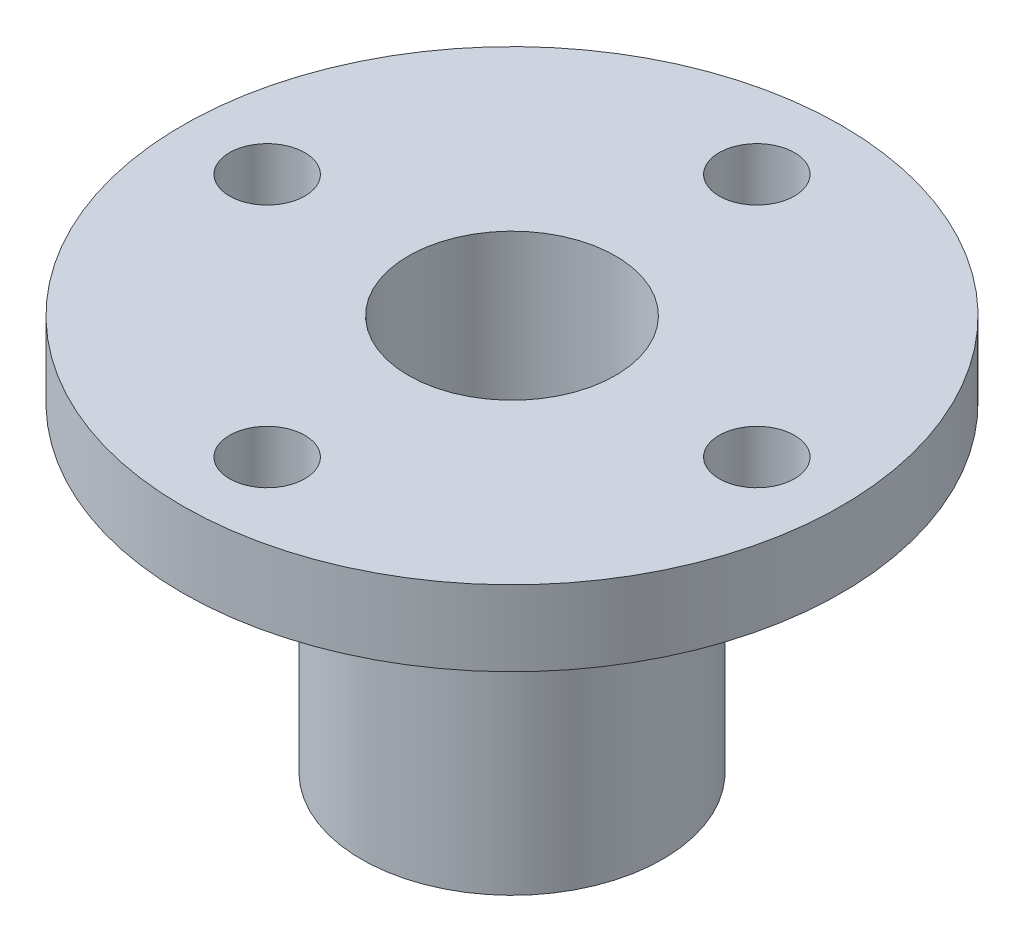
ISO-10303-21;
HEADER;
FILE_DESCRIPTION(('STEP AP214'),'2;1');
FILE_NAME('part.step','',(''),(''),'','','');
FILE_SCHEMA(('AUTOMOTIVE_DESIGN { 1 0 10303 214 1 1 1 1 }'));
ENDSEC;
DATA;
#1=APPLICATION_CONTEXT('core data for automotive mechanical design processes');
#2=APPLICATION_PROTOCOL_DEFINITION('international standard','automotive_design',2000,#1);
#3=PRODUCT_CONTEXT('',#1,'mechanical');
#4=PRODUCT('Part','Part','',(#3));
#5=PRODUCT_RELATED_PRODUCT_CATEGORY('part','',(#4));
#6=PRODUCT_DEFINITION_FORMATION('','',#4);
#7=PRODUCT_DEFINITION_CONTEXT('part definition',#1,'design');
#8=PRODUCT_DEFINITION('design','',#6,#7);
#9=PRODUCT_DEFINITION_SHAPE('','',#8);
#10=(LENGTH_UNIT() NAMED_UNIT(*) SI_UNIT(.MILLI.,.METRE.));
#11=(NAMED_UNIT(*) PLANE_ANGLE_UNIT() SI_UNIT($,.RADIAN.));
#12=(NAMED_UNIT(*) SI_UNIT($,.STERADIAN.) SOLID_ANGLE_UNIT());
#13=UNCERTAINTY_MEASURE_WITH_UNIT(LENGTH_MEASURE(1.E-05),#10,'distance_accuracy_value','');
#14=(GEOMETRIC_REPRESENTATION_CONTEXT(3) GLOBAL_UNCERTAINTY_ASSIGNED_CONTEXT((#13)) GLOBAL_UNIT_ASSIGNED_CONTEXT((#10,
#11,#12)) REPRESENTATION_CONTEXT('',''));
#15=CARTESIAN_POINT('',(0.,0.,0.));
#16=DIRECTION('',(0.,0.,1.));
#17=DIRECTION('',(1.,0.,0.));
#18=AXIS2_PLACEMENT_3D('',#15,#16,#17);
#19=CARTESIAN_POINT('',(0.,4.,0.));
#20=DIRECTION('',(0.,1.,0.));
#21=DIRECTION('',(0.,0.,1.));
#22=AXIS2_PLACEMENT_3D('',#19,#20,#21);
#23=PLANE('',#22);
#24=CARTESIAN_POINT('',(0.,4.,0.));
#25=DIRECTION('',(0.,1.,0.));
#26=DIRECTION('',(0.,0.,1.));
#27=AXIS2_PLACEMENT_3D('',#24,#25,#26);
#28=CIRCLE('',#27,5.5);
#29=CARTESIAN_POINT('',(0.,4.,5.5));
#30=VERTEX_POINT('',#29);
#31=EDGE_CURVE('E259',#30,#30,#28,.T.);
#32=ORIENTED_EDGE('',*,*,#31,.F.);
#33=EDGE_LOOP('',(#32));
#34=FACE_BOUND('',#33,.T.);
#35=CARTESIAN_POINT('',(0.,4.,13.));
#36=DIRECTION('',(0.,1.,0.));
#37=DIRECTION('',(0.,0.,1.));
#38=AXIS2_PLACEMENT_3D('',#35,#36,#37);
#39=CIRCLE('',#38,2.);
#40=CARTESIAN_POINT('',(0.,4.,15.));
#41=VERTEX_POINT('',#40);
#42=EDGE_CURVE('E57',#41,#41,#39,.T.);
#43=ORIENTED_EDGE('',*,*,#42,.F.);
#44=EDGE_LOOP('',(#43));
#45=FACE_BOUND('',#44,.T.);
#46=CARTESIAN_POINT('',(0.,4.,-13.));
#47=DIRECTION('',(0.,1.,0.));
#48=DIRECTION('',(0.,0.,1.));
#49=AXIS2_PLACEMENT_3D('',#46,#47,#48);
#50=CIRCLE('',#49,2.);
#51=CARTESIAN_POINT('',(0.,4.,-11.));
#52=VERTEX_POINT('',#51);
#53=EDGE_CURVE('E69',#52,#52,#50,.T.);
#54=ORIENTED_EDGE('',*,*,#53,.F.);
#55=EDGE_LOOP('',(#54));
#56=FACE_BOUND('',#55,.T.);
#57=CARTESIAN_POINT('',(0.,4.,0.));
#58=DIRECTION('',(0.,1.,0.));
#59=DIRECTION('',(0.,0.,1.));
#60=AXIS2_PLACEMENT_3D('',#57,#58,#59);
#61=CIRCLE('',#60,17.5);
#62=CARTESIAN_POINT('',(0.,4.,17.5));
#63=VERTEX_POINT('',#62);
#64=EDGE_CURVE('E39',#63,#63,#61,.T.);
#65=ORIENTED_EDGE('',*,*,#64,.T.);
#66=EDGE_LOOP('',(#65));
#67=FACE_BOUND('',#66,.T.);
#68=CARTESIAN_POINT('',(13.,4.,0.));
#69=DIRECTION('',(0.,1.,0.));
#70=DIRECTION('',(0.,0.,1.));
#71=AXIS2_PLACEMENT_3D('',#68,#69,#70);
#72=CIRCLE('',#71,2.);
#73=CARTESIAN_POINT('',(13.,4.,2.00000000000005));
#74=VERTEX_POINT('',#73);
#75=EDGE_CURVE('E63',#74,#74,#72,.T.);
#76=ORIENTED_EDGE('',*,*,#75,.F.);
#77=EDGE_LOOP('',(#76));
#78=FACE_BOUND('',#77,.T.);
#79=CARTESIAN_POINT('',(-13.,4.,-1.36167772214882E-13));
#80=DIRECTION('',(0.,1.,0.));
#81=DIRECTION('',(0.,0.,1.));
#82=AXIS2_PLACEMENT_3D('',#79,#80,#81);
#83=CIRCLE('',#82,2.);
#84=CARTESIAN_POINT('',(-13.,4.,1.99999999999986));
#85=VERTEX_POINT('',#84);
#86=EDGE_CURVE('E50',#85,#85,#83,.T.);
#87=ORIENTED_EDGE('',*,*,#86,.F.);
#88=EDGE_LOOP('',(#87));
#89=FACE_BOUND('',#88,.T.);
#90=ADVANCED_FACE('F31',(#34,#45,#56,#67,#78,#89),#23,.T.);
#91=CARTESIAN_POINT('',(0.,0.,0.));
#92=DIRECTION('',(0.,1.,0.));
#93=DIRECTION('',(0.,0.,1.));
#94=AXIS2_PLACEMENT_3D('',#91,#92,#93);
#95=PLANE('',#94);
#96=CARTESIAN_POINT('',(0.,0.,0.));
#97=DIRECTION('',(0.,-1.,0.));
#98=DIRECTION('',(0.,0.,-1.));
#99=AXIS2_PLACEMENT_3D('',#96,#97,#98);
#100=CIRCLE('',#99,8.);
#101=CARTESIAN_POINT('',(0.,0.,-8.));
#102=VERTEX_POINT('',#101);
#103=EDGE_CURVE('E10',#102,#102,#100,.T.);
#104=ORIENTED_EDGE('',*,*,#103,.F.);
#105=EDGE_LOOP('',(#104));
#106=FACE_BOUND('',#105,.T.);
#107=CARTESIAN_POINT('',(0.,0.,0.));
#108=DIRECTION('',(0.,1.,0.));
#109=DIRECTION('',(0.,0.,1.));
#110=AXIS2_PLACEMENT_3D('',#107,#108,#109);
#111=CIRCLE('',#110,17.5);
#112=CARTESIAN_POINT('',(0.,0.,17.5));
#113=VERTEX_POINT('',#112);
#114=EDGE_CURVE('E44',#113,#113,#111,.T.);
#115=ORIENTED_EDGE('',*,*,#114,.F.);
#116=EDGE_LOOP('',(#115));
#117=FACE_BOUND('',#116,.T.);
#118=CARTESIAN_POINT('',(0.,0.,-13.));
#119=DIRECTION('',(0.,1.,0.));
#120=DIRECTION('',(0.,0.,1.));
#121=AXIS2_PLACEMENT_3D('',#118,#119,#120);
#122=CIRCLE('',#121,2.);
#123=CARTESIAN_POINT('',(0.,0.,-11.));
#124=VERTEX_POINT('',#123);
#125=EDGE_CURVE('E66',#124,#124,#122,.T.);
#126=ORIENTED_EDGE('',*,*,#125,.T.);
#127=EDGE_LOOP('',(#126));
#128=FACE_BOUND('',#127,.T.);
#129=CARTESIAN_POINT('',(13.,0.,0.));
#130=DIRECTION('',(0.,1.,0.));
#131=DIRECTION('',(0.,0.,1.));
#132=AXIS2_PLACEMENT_3D('',#129,#130,#131);
#133=CIRCLE('',#132,2.);
#134=CARTESIAN_POINT('',(13.,0.,2.00000000000005));
#135=VERTEX_POINT('',#134);
#136=EDGE_CURVE('E60',#135,#135,#133,.T.);
#137=ORIENTED_EDGE('',*,*,#136,.T.);
#138=EDGE_LOOP('',(#137));
#139=FACE_BOUND('',#138,.T.);
#140=CARTESIAN_POINT('',(0.,0.,13.));
#141=DIRECTION('',(0.,1.,0.));
#142=DIRECTION('',(0.,0.,1.));
#143=AXIS2_PLACEMENT_3D('',#140,#141,#142);
#144=CIRCLE('',#143,2.);
#145=CARTESIAN_POINT('',(0.,0.,15.));
#146=VERTEX_POINT('',#145);
#147=EDGE_CURVE('E53',#146,#146,#144,.T.);
#148=ORIENTED_EDGE('',*,*,#147,.T.);
#149=EDGE_LOOP('',(#148));
#150=FACE_BOUND('',#149,.T.);
#151=CARTESIAN_POINT('',(-13.,0.,-1.36167772214882E-13));
#152=DIRECTION('',(0.,1.,0.));
#153=DIRECTION('',(0.,0.,1.));
#154=AXIS2_PLACEMENT_3D('',#151,#152,#153);
#155=CIRCLE('',#154,2.);
#156=CARTESIAN_POINT('',(-13.,0.,1.99999999999986));
#157=VERTEX_POINT('',#156);
#158=EDGE_CURVE('E54',#157,#157,#155,.T.);
#159=ORIENTED_EDGE('',*,*,#158,.T.);
#160=EDGE_LOOP('',(#159));
#161=FACE_BOUND('',#160,.T.);
#162=ADVANCED_FACE('F77',(#106,#117,#128,#139,#150,#161),#95,.F.);
#163=CARTESIAN_POINT('',(0.,4.,0.));
#164=DIRECTION('',(0.,-1.,0.));
#165=DIRECTION('',(0.,0.,-1.));
#166=AXIS2_PLACEMENT_3D('',#163,#164,#165);
#167=CYLINDRICAL_SURFACE('',#166,17.5);
#168=ORIENTED_EDGE('',*,*,#64,.F.);
#169=EDGE_LOOP('',(#168));
#170=FACE_BOUND('',#169,.T.);
#171=ORIENTED_EDGE('',*,*,#114,.T.);
#172=EDGE_LOOP('',(#171));
#173=FACE_BOUND('',#172,.T.);
#174=ADVANCED_FACE('F33',(#170,#173),#167,.T.);
#175=CARTESIAN_POINT('',(0.,4.,-13.));
#176=DIRECTION('',(0.,-1.,0.));
#177=DIRECTION('',(0.,0.,-1.));
#178=AXIS2_PLACEMENT_3D('',#175,#176,#177);
#179=CYLINDRICAL_SURFACE('',#178,2.);
#180=ORIENTED_EDGE('',*,*,#53,.T.);
#181=EDGE_LOOP('',(#180));
#182=FACE_BOUND('',#181,.T.);
#183=ORIENTED_EDGE('',*,*,#125,.F.);
#184=EDGE_LOOP('',(#183));
#185=FACE_BOUND('',#184,.T.);
#186=ADVANCED_FACE('F113',(#182,#185),#179,.F.);
#187=CARTESIAN_POINT('',(13.,4.,0.));
#188=DIRECTION('',(0.,-1.,0.));
#189=DIRECTION('',(0.,0.,-1.));
#190=AXIS2_PLACEMENT_3D('',#187,#188,#189);
#191=CYLINDRICAL_SURFACE('',#190,2.);
#192=ORIENTED_EDGE('',*,*,#75,.T.);
#193=EDGE_LOOP('',(#192));
#194=FACE_BOUND('',#193,.T.);
#195=ORIENTED_EDGE('',*,*,#136,.F.);
#196=EDGE_LOOP('',(#195));
#197=FACE_BOUND('',#196,.T.);
#198=ADVANCED_FACE('F102',(#194,#197),#191,.F.);
#199=CARTESIAN_POINT('',(0.,4.,13.));
#200=DIRECTION('',(0.,-1.,0.));
#201=DIRECTION('',(0.,0.,-1.));
#202=AXIS2_PLACEMENT_3D('',#199,#200,#201);
#203=CYLINDRICAL_SURFACE('',#202,2.);
#204=ORIENTED_EDGE('',*,*,#42,.T.);
#205=EDGE_LOOP('',(#204));
#206=FACE_BOUND('',#205,.T.);
#207=ORIENTED_EDGE('',*,*,#147,.F.);
#208=EDGE_LOOP('',(#207));
#209=FACE_BOUND('',#208,.T.);
#210=ADVANCED_FACE('F92',(#206,#209),#203,.F.);
#211=CARTESIAN_POINT('',(-13.,4.,-1.36167772214882E-13));
#212=DIRECTION('',(0.,-1.,0.));
#213=DIRECTION('',(0.,0.,-1.));
#214=AXIS2_PLACEMENT_3D('',#211,#212,#213);
#215=CYLINDRICAL_SURFACE('',#214,2.);
#216=ORIENTED_EDGE('',*,*,#86,.T.);
#217=EDGE_LOOP('',(#216));
#218=FACE_BOUND('',#217,.T.);
#219=ORIENTED_EDGE('',*,*,#158,.F.);
#220=EDGE_LOOP('',(#219));
#221=FACE_BOUND('',#220,.T.);
#222=ADVANCED_FACE('F89',(#218,#221),#215,.F.);
#223=CARTESIAN_POINT('',(0.,-17.,0.));
#224=DIRECTION('',(0.,1.,0.));
#225=DIRECTION('',(0.,0.,1.));
#226=AXIS2_PLACEMENT_3D('',#223,#224,#225);
#227=CYLINDRICAL_SURFACE('',#226,8.);
#228=CARTESIAN_POINT('',(0.,-17.,0.));
#229=DIRECTION('',(0.,-1.,0.));
#230=DIRECTION('',(0.,0.,-1.));
#231=AXIS2_PLACEMENT_3D('',#228,#229,#230);
#232=CIRCLE('',#231,8.);
#233=CARTESIAN_POINT('',(0.,-17.,-8.));
#234=VERTEX_POINT('',#233);
#235=EDGE_CURVE('E48',#234,#234,#232,.T.);
#236=ORIENTED_EDGE('',*,*,#235,.F.);
#237=EDGE_LOOP('',(#236));
#238=FACE_BOUND('',#237,.T.);
#239=ORIENTED_EDGE('',*,*,#103,.T.);
#240=EDGE_LOOP('',(#239));
#241=FACE_BOUND('',#240,.T.);
#242=ADVANCED_FACE('F91',(#238,#241),#227,.T.);
#243=CARTESIAN_POINT('',(0.,-17.,0.));
#244=DIRECTION('',(0.,-1.,0.));
#245=DIRECTION('',(0.,0.,-1.));
#246=AXIS2_PLACEMENT_3D('',#243,#244,#245);
#247=PLANE('',#246);
#248=CARTESIAN_POINT('',(0.,-17.,0.));
#249=DIRECTION('',(0.,-1.,0.));
#250=DIRECTION('',(0.,0.,-1.));
#251=AXIS2_PLACEMENT_3D('',#248,#249,#250);
#252=CIRCLE('',#251,2.75);
#253=CARTESIAN_POINT('',(0.,-17.,-2.75));
#254=VERTEX_POINT('',#253);
#255=EDGE_CURVE('E242',#254,#254,#252,.T.);
#256=ORIENTED_EDGE('',*,*,#255,.F.);
#257=EDGE_LOOP('',(#256));
#258=FACE_BOUND('',#257,.T.);
#259=ORIENTED_EDGE('',*,*,#235,.T.);
#260=EDGE_LOOP('',(#259));
#261=FACE_BOUND('',#260,.T.);
#262=ADVANCED_FACE('F99',(#258,#261),#247,.T.);
#263=CARTESIAN_POINT('',(0.,-8.,0.));
#264=DIRECTION('',(0.,1.,0.));
#265=DIRECTION('',(0.,0.,1.));
#266=AXIS2_PLACEMENT_3D('',#263,#264,#265);
#267=CYLINDRICAL_SURFACE('',#266,5.5);
#268=CARTESIAN_POINT('',(0.,-8.,0.));
#269=DIRECTION('',(0.,1.,0.));
#270=DIRECTION('',(0.,0.,1.));
#271=AXIS2_PLACEMENT_3D('',#268,#269,#270);
#272=CIRCLE('',#271,5.5);
#273=CARTESIAN_POINT('',(0.,-8.,5.5));
#274=VERTEX_POINT('',#273);
#275=EDGE_CURVE('E255',#274,#274,#272,.T.);
#276=ORIENTED_EDGE('',*,*,#275,.F.);
#277=EDGE_LOOP('',(#276));
#278=FACE_BOUND('',#277,.T.);
#279=ORIENTED_EDGE('',*,*,#31,.T.);
#280=EDGE_LOOP('',(#279));
#281=FACE_BOUND('',#280,.T.);
#282=ADVANCED_FACE('F161',(#278,#281),#267,.F.);
#283=CARTESIAN_POINT('',(0.,-9.1,0.));
#284=DIRECTION('',(0.,1.,0.));
#285=DIRECTION('',(0.,0.,1.));
#286=AXIS2_PLACEMENT_3D('',#283,#284,#285);
#287=CYLINDRICAL_SURFACE('',#286,6.);
#288=CARTESIAN_POINT('',(0.,-9.1,0.));
#289=DIRECTION('',(0.,1.,0.));
#290=DIRECTION('',(0.,0.,1.));
#291=AXIS2_PLACEMENT_3D('',#288,#289,#290);
#292=CIRCLE('',#291,6.);
#293=CARTESIAN_POINT('',(0.,-9.1,6.));
#294=VERTEX_POINT('',#293);
#295=EDGE_CURVE('E252',#294,#294,#292,.T.);
#296=ORIENTED_EDGE('',*,*,#295,.F.);
#297=EDGE_LOOP('',(#296));
#298=FACE_BOUND('',#297,.T.);
#299=CARTESIAN_POINT('',(0.,-8.,0.));
#300=DIRECTION('',(0.,1.,0.));
#301=DIRECTION('',(0.,0.,1.));
#302=AXIS2_PLACEMENT_3D('',#299,#300,#301);
#303=CIRCLE('',#302,6.);
#304=CARTESIAN_POINT('',(0.,-8.,6.));
#305=VERTEX_POINT('',#304);
#306=EDGE_CURVE('E249',#305,#305,#303,.T.);
#307=ORIENTED_EDGE('',*,*,#306,.T.);
#308=EDGE_LOOP('',(#307));
#309=FACE_BOUND('',#308,.T.);
#310=ADVANCED_FACE('F166',(#298,#309),#287,.F.);
#311=CARTESIAN_POINT('',(0.,-9.1,0.));
#312=DIRECTION('',(0.,1.,0.));
#313=DIRECTION('',(0.,0.,1.));
#314=AXIS2_PLACEMENT_3D('',#311,#312,#313);
#315=PLANE('',#314);
#316=CARTESIAN_POINT('',(0.,-9.1,0.));
#317=DIRECTION('',(0.,1.,0.));
#318=DIRECTION('',(0.,0.,1.));
#319=AXIS2_PLACEMENT_3D('',#316,#317,#318);
#320=CIRCLE('',#319,5.5);
#321=CARTESIAN_POINT('',(0.,-9.1,5.5));
#322=VERTEX_POINT('',#321);
#323=EDGE_CURVE('E244',#322,#322,#320,.T.);
#324=ORIENTED_EDGE('',*,*,#323,.F.);
#325=EDGE_LOOP('',(#324));
#326=FACE_BOUND('',#325,.T.);
#327=ORIENTED_EDGE('',*,*,#295,.T.);
#328=EDGE_LOOP('',(#327));
#329=FACE_BOUND('',#328,.T.);
#330=ADVANCED_FACE('F176',(#326,#329),#315,.T.);
#331=CARTESIAN_POINT('',(0.,-8.,0.));
#332=DIRECTION('',(0.,1.,0.));
#333=DIRECTION('',(0.,0.,1.));
#334=AXIS2_PLACEMENT_3D('',#331,#332,#333);
#335=PLANE('',#334);
#336=ORIENTED_EDGE('',*,*,#275,.T.);
#337=EDGE_LOOP('',(#336));
#338=FACE_BOUND('',#337,.T.);
#339=ORIENTED_EDGE('',*,*,#306,.F.);
#340=EDGE_LOOP('',(#339));
#341=FACE_BOUND('',#340,.T.);
#342=ADVANCED_FACE('F184',(#338,#341),#335,.F.);
#343=CARTESIAN_POINT('',(0.,-12.,0.));
#344=DIRECTION('',(0.,1.,0.));
#345=DIRECTION('',(0.,0.,1.));
#346=AXIS2_PLACEMENT_3D('',#343,#344,#345);
#347=CYLINDRICAL_SURFACE('',#346,5.5);
#348=CARTESIAN_POINT('',(0.,-12.,0.));
#349=DIRECTION('',(0.,1.,0.));
#350=DIRECTION('',(0.,0.,1.));
#351=AXIS2_PLACEMENT_3D('',#348,#349,#350);
#352=CIRCLE('',#351,5.5);
#353=CARTESIAN_POINT('',(0.,-12.,5.5));
#354=VERTEX_POINT('',#353);
#355=EDGE_CURVE('E246',#354,#354,#352,.T.);
#356=ORIENTED_EDGE('',*,*,#355,.F.);
#357=EDGE_LOOP('',(#356));
#358=FACE_BOUND('',#357,.T.);
#359=ORIENTED_EDGE('',*,*,#323,.T.);
#360=EDGE_LOOP('',(#359));
#361=FACE_BOUND('',#360,.T.);
#362=ADVANCED_FACE('F189',(#358,#361),#347,.F.);
#363=CARTESIAN_POINT('',(0.,-12.,0.));
#364=DIRECTION('',(0.,1.,0.));
#365=DIRECTION('',(0.,0.,1.));
#366=AXIS2_PLACEMENT_3D('',#363,#364,#365);
#367=PLANE('',#366);
#368=CARTESIAN_POINT('',(0.,-12.,0.));
#369=DIRECTION('',(0.,1.,0.));
#370=DIRECTION('',(0.,0.,1.));
#371=AXIS2_PLACEMENT_3D('',#368,#369,#370);
#372=CIRCLE('',#371,2.75);
#373=CARTESIAN_POINT('',(0.,-12.,2.75));
#374=VERTEX_POINT('',#373);
#375=EDGE_CURVE('E35',#374,#374,#372,.T.);
#376=ORIENTED_EDGE('',*,*,#375,.F.);
#377=EDGE_LOOP('',(#376));
#378=FACE_BOUND('',#377,.T.);
#379=ORIENTED_EDGE('',*,*,#355,.T.);
#380=EDGE_LOOP('',(#379));
#381=FACE_BOUND('',#380,.T.);
#382=ADVANCED_FACE('F206',(#378,#381),#367,.T.);
#383=CARTESIAN_POINT('',(0.,-11.5,0.));
#384=DIRECTION('',(0.,-1.,0.));
#385=DIRECTION('',(0.,0.,-1.));
#386=AXIS2_PLACEMENT_3D('',#383,#384,#385);
#387=CYLINDRICAL_SURFACE('',#386,2.75);
#388=ORIENTED_EDGE('',*,*,#375,.T.);
#389=EDGE_LOOP('',(#388));
#390=FACE_BOUND('',#389,.T.);
#391=ORIENTED_EDGE('',*,*,#255,.T.);
#392=EDGE_LOOP('',(#391));
#393=FACE_BOUND('',#392,.T.);
#394=ADVANCED_FACE('F223',(#390,#393),#387,.F.);
#395=CLOSED_SHELL('',(#90,#162,#174,#186,#198,#210,#222,#242,#262,#282,#310,#330,#342,#362,#382,#394));
#396=MANIFOLD_SOLID_BREP('B2',#395);
#397=ADVANCED_BREP_SHAPE_REPRESENTATION('',(#18,#396),#14);
#398=SHAPE_DEFINITION_REPRESENTATION(#9,#397);
ENDSEC;
END-ISO-10303-21;
